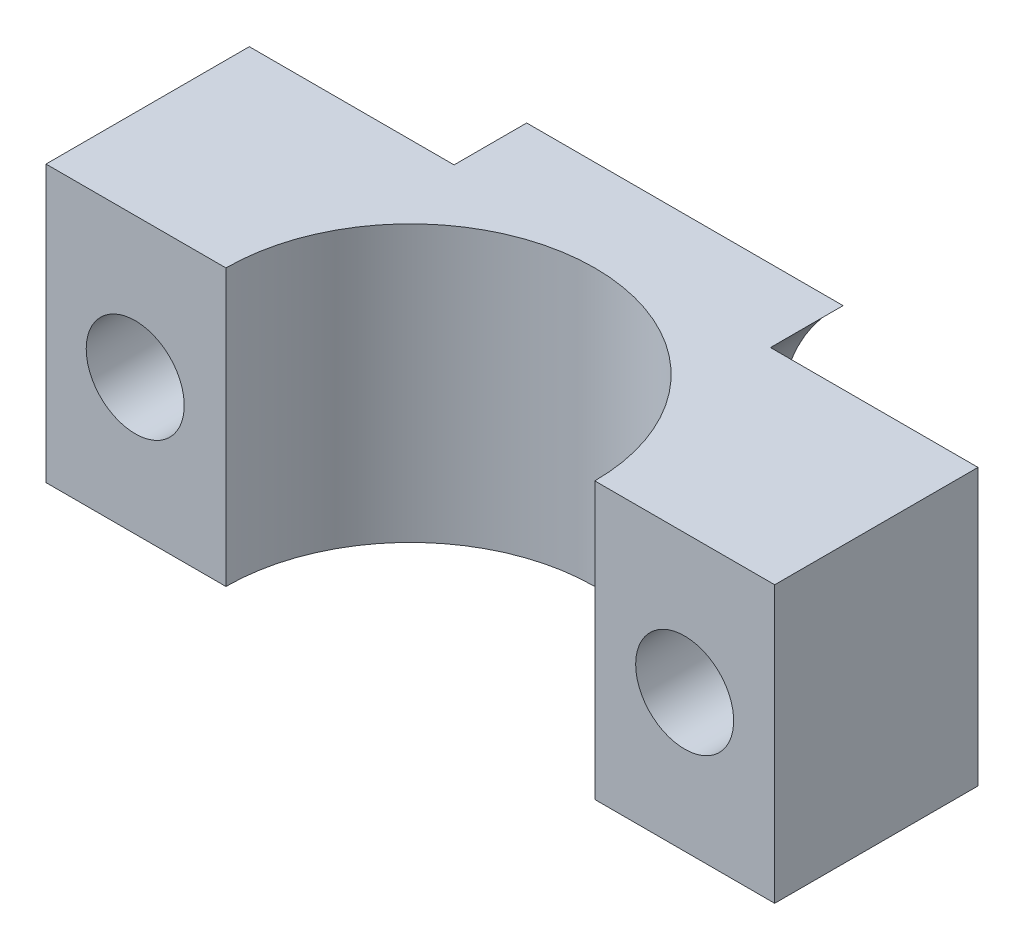
ISO-10303-21;
HEADER;
FILE_DESCRIPTION(('STEP AP214'),'2;1');
FILE_NAME('part.step','',(''),(''),'','','');
FILE_SCHEMA(('AUTOMOTIVE_DESIGN { 1 0 10303 214 1 1 1 1 }'));
ENDSEC;
DATA;
#1=APPLICATION_CONTEXT('core data for automotive mechanical design processes');
#2=APPLICATION_PROTOCOL_DEFINITION('international standard','automotive_design',2000,#1);
#3=PRODUCT_CONTEXT('',#1,'mechanical');
#4=PRODUCT('Part','Part','',(#3));
#5=PRODUCT_RELATED_PRODUCT_CATEGORY('part','',(#4));
#6=PRODUCT_DEFINITION_FORMATION('','',#4);
#7=PRODUCT_DEFINITION_CONTEXT('part definition',#1,'design');
#8=PRODUCT_DEFINITION('design','',#6,#7);
#9=PRODUCT_DEFINITION_SHAPE('','',#8);
#10=(LENGTH_UNIT() NAMED_UNIT(*) SI_UNIT(.MILLI.,.METRE.));
#11=(NAMED_UNIT(*) PLANE_ANGLE_UNIT() SI_UNIT($,.RADIAN.));
#12=(NAMED_UNIT(*) SI_UNIT($,.STERADIAN.) SOLID_ANGLE_UNIT());
#13=UNCERTAINTY_MEASURE_WITH_UNIT(LENGTH_MEASURE(1.E-05),#10,'distance_accuracy_value','');
#14=(GEOMETRIC_REPRESENTATION_CONTEXT(3) GLOBAL_UNCERTAINTY_ASSIGNED_CONTEXT((#13)) GLOBAL_UNIT_ASSIGNED_CONTEXT((#10,
#11,#12)) REPRESENTATION_CONTEXT('',''));
#15=CARTESIAN_POINT('',(0.,0.,0.));
#16=DIRECTION('',(0.,0.,1.));
#17=DIRECTION('',(1.,0.,0.));
#18=AXIS2_PLACEMENT_3D('',#15,#16,#17);
#19=CARTESIAN_POINT('',(0.,9.5,0.));
#20=DIRECTION('',(0.,-1.,0.));
#21=DIRECTION('',(0.,0.,-1.));
#22=AXIS2_PLACEMENT_3D('',#19,#20,#21);
#23=CYLINDRICAL_SURFACE('',#22,12.7);
#24=CARTESIAN_POINT('',(0.,-9.5,0.));
#25=DIRECTION('',(0.,1.,0.));
#26=DIRECTION('',(0.,0.,1.));
#27=AXIS2_PLACEMENT_3D('',#24,#25,#26);
#28=CIRCLE('',#27,12.7);
#29=CARTESIAN_POINT('',(12.7,-9.5,0.));
#30=VERTEX_POINT('',#29);
#31=CARTESIAN_POINT('',(-12.7,-9.5,0.));
#32=VERTEX_POINT('',#31);
#33=EDGE_CURVE('E176',#30,#32,#28,.T.);
#34=ORIENTED_EDGE('',*,*,#33,.F.);
#35=DIRECTION('',(0.,-1.,0.));
#36=VECTOR('',#35,1.);
#37=CARTESIAN_POINT('',(12.7,9.5,0.));
#38=LINE('',#37,#36);
#39=CARTESIAN_POINT('',(12.7,9.5,0.));
#40=VERTEX_POINT('',#39);
#41=EDGE_CURVE('E146',#40,#30,#38,.T.);
#42=ORIENTED_EDGE('',*,*,#41,.F.);
#43=CARTESIAN_POINT('',(0.,9.5,0.));
#44=DIRECTION('',(0.,1.,0.));
#45=DIRECTION('',(0.,0.,1.));
#46=AXIS2_PLACEMENT_3D('',#43,#44,#45);
#47=CIRCLE('',#46,12.7);
#48=CARTESIAN_POINT('',(-12.7,9.5,0.));
#49=VERTEX_POINT('',#48);
#50=EDGE_CURVE('E170',#40,#49,#47,.T.);
#51=ORIENTED_EDGE('',*,*,#50,.T.);
#52=DIRECTION('',(0.,-1.,0.));
#53=VECTOR('',#52,1.);
#54=CARTESIAN_POINT('',(-12.7,9.5,0.));
#55=LINE('',#54,#53);
#56=EDGE_CURVE('E138',#49,#32,#55,.T.);
#57=ORIENTED_EDGE('',*,*,#56,.T.);
#58=EDGE_LOOP('',(#34,#42,#51,#57));
#59=FACE_BOUND('',#58,.T.);
#60=ADVANCED_FACE('F32',(#59),#23,.F.);
#61=CARTESIAN_POINT('',(0.,9.5,0.));
#62=DIRECTION('',(0.,0.,-1.));
#63=DIRECTION('',(-1.,0.,0.));
#64=AXIS2_PLACEMENT_3D('',#61,#62,#63);
#65=PLANE('',#64);
#66=CARTESIAN_POINT('',(18.8898376590317,-0.0280681094487162,0.));
#67=DIRECTION('',(0.,0.,-1.));
#68=DIRECTION('',(-1.,0.,0.));
#69=AXIS2_PLACEMENT_3D('',#66,#67,#68);
#70=CIRCLE('',#69,3.375);
#71=CARTESIAN_POINT('',(15.5148376590317,-0.0280681094487162,0.));
#72=VERTEX_POINT('',#71);
#73=EDGE_CURVE('E114',#72,#72,#70,.T.);
#74=ORIENTED_EDGE('',*,*,#73,.T.);
#75=EDGE_LOOP('',(#74));
#76=FACE_BOUND('',#75,.T.);
#77=DIRECTION('',(1.,0.,0.));
#78=VECTOR('',#77,1.);
#79=CARTESIAN_POINT('',(0.,-9.5,0.));
#80=LINE('',#79,#78);
#81=CARTESIAN_POINT('',(25.09,-9.5,0.));
#82=VERTEX_POINT('',#81);
#83=EDGE_CURVE('E134',#30,#82,#80,.T.);
#84=ORIENTED_EDGE('',*,*,#83,.T.);
#85=DIRECTION('',(0.,-1.,0.));
#86=VECTOR('',#85,1.);
#87=CARTESIAN_POINT('',(25.09,9.5,0.));
#88=LINE('',#87,#86);
#89=CARTESIAN_POINT('',(25.09,9.5,0.));
#90=VERTEX_POINT('',#89);
#91=EDGE_CURVE('E143',#90,#82,#88,.T.);
#92=ORIENTED_EDGE('',*,*,#91,.F.);
#93=DIRECTION('',(1.,0.,0.));
#94=VECTOR('',#93,1.);
#95=CARTESIAN_POINT('',(0.,9.5,0.));
#96=LINE('',#95,#94);
#97=EDGE_CURVE('E164',#40,#90,#96,.T.);
#98=ORIENTED_EDGE('',*,*,#97,.F.);
#99=ORIENTED_EDGE('',*,*,#41,.T.);
#100=EDGE_LOOP('',(#84,#92,#98,#99));
#101=FACE_BOUND('',#100,.T.);
#102=ADVANCED_FACE('F224',(#76,#101),#65,.F.);
#103=CARTESIAN_POINT('',(25.09,9.5,0.));
#104=DIRECTION('',(-1.,0.,0.));
#105=DIRECTION('',(0.,0.,1.));
#106=AXIS2_PLACEMENT_3D('',#103,#104,#105);
#107=PLANE('',#106);
#108=DIRECTION('',(0.,0.,-1.));
#109=VECTOR('',#108,1.);
#110=CARTESIAN_POINT('',(25.09,-9.5,0.));
#111=LINE('',#110,#109);
#112=CARTESIAN_POINT('',(25.09,-9.5,-14.));
#113=VERTEX_POINT('',#112);
#114=EDGE_CURVE('E128',#82,#113,#111,.T.);
#115=ORIENTED_EDGE('',*,*,#114,.T.);
#116=DIRECTION('',(0.,1.,0.));
#117=VECTOR('',#116,1.);
#118=CARTESIAN_POINT('',(25.09,9.5,-14.));
#119=LINE('',#118,#117);
#120=CARTESIAN_POINT('',(25.09,9.5,-14.));
#121=VERTEX_POINT('',#120);
#122=EDGE_CURVE('E113',#113,#121,#119,.T.);
#123=ORIENTED_EDGE('',*,*,#122,.T.);
#124=DIRECTION('',(0.,0.,-1.));
#125=VECTOR('',#124,1.);
#126=CARTESIAN_POINT('',(25.09,9.5,0.));
#127=LINE('',#126,#125);
#128=EDGE_CURVE('E161',#90,#121,#127,.T.);
#129=ORIENTED_EDGE('',*,*,#128,.F.);
#130=ORIENTED_EDGE('',*,*,#91,.T.);
#131=EDGE_LOOP('',(#115,#123,#129,#130));
#132=FACE_BOUND('',#131,.T.);
#133=ADVANCED_FACE('F228',(#132),#107,.F.);
#134=CARTESIAN_POINT('',(0.,9.5,-19.));
#135=DIRECTION('',(0.,0.,-1.));
#136=DIRECTION('',(-1.,0.,0.));
#137=AXIS2_PLACEMENT_3D('',#134,#135,#136);
#138=PLANE('',#137);
#139=CARTESIAN_POINT('',(18.8898376590317,-0.0280681094487162,-19.));
#140=DIRECTION('',(0.,0.,-1.));
#141=DIRECTION('',(-1.,0.,0.));
#142=AXIS2_PLACEMENT_3D('',#139,#140,#141);
#143=CIRCLE('',#142,12.5);
#144=CARTESIAN_POINT('',(10.7330916006603,-9.5,-19.));
#145=VERTEX_POINT('',#144);
#146=CARTESIAN_POINT('',(10.7987364915944,9.5,-19.));
#147=VERTEX_POINT('',#146);
#148=EDGE_CURVE('E46',#145,#147,#143,.T.);
#149=ORIENTED_EDGE('',*,*,#148,.F.);
#150=DIRECTION('',(1.,0.,0.));
#151=VECTOR('',#150,1.);
#152=CARTESIAN_POINT('',(0.,-9.5,-19.));
#153=LINE('',#152,#151);
#154=CARTESIAN_POINT('',(-10.6606389463509,-9.5,-19.));
#155=VERTEX_POINT('',#154);
#156=EDGE_CURVE('E120',#155,#145,#153,.T.);
#157=ORIENTED_EDGE('',*,*,#156,.F.);
#158=CARTESIAN_POINT('',(-18.9459738779293,-0.140340547243853,-19.));
#159=DIRECTION('',(0.,0.,-1.));
#160=DIRECTION('',(-1.,0.,0.));
#161=AXIS2_PLACEMENT_3D('',#158,#159,#160);
#162=CIRCLE('',#161,12.5);
#163=CARTESIAN_POINT('',(-10.9889748121278,9.5,-19.));
#164=VERTEX_POINT('',#163);
#165=EDGE_CURVE('E54',#164,#155,#162,.T.);
#166=ORIENTED_EDGE('',*,*,#165,.F.);
#167=DIRECTION('',(1.,0.,0.));
#168=VECTOR('',#167,1.);
#169=CARTESIAN_POINT('',(0.,9.5,-19.));
#170=LINE('',#169,#168);
#171=EDGE_CURVE('E122',#164,#147,#170,.T.);
#172=ORIENTED_EDGE('',*,*,#171,.T.);
#173=EDGE_LOOP('',(#149,#157,#166,#172));
#174=FACE_BOUND('',#173,.T.);
#175=ADVANCED_FACE('F119',(#174),#138,.T.);
#176=CARTESIAN_POINT('',(-25.09,9.5,0.));
#177=DIRECTION('',(-1.,0.,0.));
#178=DIRECTION('',(0.,0.,1.));
#179=AXIS2_PLACEMENT_3D('',#176,#177,#178);
#180=PLANE('',#179);
#181=DIRECTION('',(0.,1.,0.));
#182=VECTOR('',#181,1.);
#183=CARTESIAN_POINT('',(-25.09,9.5,-14.));
#184=LINE('',#183,#182);
#185=CARTESIAN_POINT('',(-25.09,-9.5,-14.));
#186=VERTEX_POINT('',#185);
#187=CARTESIAN_POINT('',(-25.09,9.5,-14.));
#188=VERTEX_POINT('',#187);
#189=EDGE_CURVE('E189',#186,#188,#184,.T.);
#190=ORIENTED_EDGE('',*,*,#189,.F.);
#191=DIRECTION('',(0.,0.,-1.));
#192=VECTOR('',#191,1.);
#193=CARTESIAN_POINT('',(-25.09,-9.5,0.));
#194=LINE('',#193,#192);
#195=CARTESIAN_POINT('',(-25.09,-9.5,0.));
#196=VERTEX_POINT('',#195);
#197=EDGE_CURVE('E127',#196,#186,#194,.T.);
#198=ORIENTED_EDGE('',*,*,#197,.F.);
#199=DIRECTION('',(0.,-1.,0.));
#200=VECTOR('',#199,1.);
#201=CARTESIAN_POINT('',(-25.09,9.5,0.));
#202=LINE('',#201,#200);
#203=CARTESIAN_POINT('',(-25.09,9.5,0.));
#204=VERTEX_POINT('',#203);
#205=EDGE_CURVE('E140',#204,#196,#202,.T.);
#206=ORIENTED_EDGE('',*,*,#205,.F.);
#207=DIRECTION('',(0.,0.,-1.));
#208=VECTOR('',#207,1.);
#209=CARTESIAN_POINT('',(-25.09,9.5,0.));
#210=LINE('',#209,#208);
#211=EDGE_CURVE('E168',#204,#188,#210,.T.);
#212=ORIENTED_EDGE('',*,*,#211,.T.);
#213=EDGE_LOOP('',(#190,#198,#206,#212));
#214=FACE_BOUND('',#213,.T.);
#215=ADVANCED_FACE('F239',(#214),#180,.T.);
#216=CARTESIAN_POINT('',(-18.9459738779293,-0.140340547243853,0.));
#217=DIRECTION('',(0.,0.,-1.));
#218=DIRECTION('',(-1.,0.,0.));
#219=AXIS2_PLACEMENT_3D('',#216,#217,#218);
#220=CIRCLE('',#219,3.375);
#221=CARTESIAN_POINT('',(-22.3209738779293,-0.140340547243853,0.));
#222=VERTEX_POINT('',#221);
#223=EDGE_CURVE('E193',#222,#222,#220,.T.);
#224=ORIENTED_EDGE('',*,*,#223,.T.);
#225=EDGE_LOOP('',(#224));
#226=FACE_BOUND('',#225,.T.);
#227=EDGE_CURVE('E131',#196,#32,#80,.T.);
#228=ORIENTED_EDGE('',*,*,#227,.T.);
#229=ORIENTED_EDGE('',*,*,#56,.F.);
#230=EDGE_CURVE('E141',#204,#49,#96,.T.);
#231=ORIENTED_EDGE('',*,*,#230,.F.);
#232=ORIENTED_EDGE('',*,*,#205,.T.);
#233=EDGE_LOOP('',(#228,#229,#231,#232));
#234=FACE_BOUND('',#233,.T.);
#235=ADVANCED_FACE('F231',(#226,#234),#65,.F.);
#236=CARTESIAN_POINT('',(0.,9.5,0.));
#237=DIRECTION('',(0.,1.,0.));
#238=DIRECTION('',(0.,0.,1.));
#239=AXIS2_PLACEMENT_3D('',#236,#237,#238);
#240=PLANE('',#239);
#241=DIRECTION('',(1.,0.,0.));
#242=VECTOR('',#241,1.);
#243=CARTESIAN_POINT('',(0.,9.5,-14.));
#244=LINE('',#243,#242);
#245=CARTESIAN_POINT('',(10.7987364915944,9.5,-14.));
#246=VERTEX_POINT('',#245);
#247=EDGE_CURVE('E11',#246,#121,#244,.T.);
#248=ORIENTED_EDGE('',*,*,#247,.F.);
#249=DIRECTION('',(0.,0.,-1.));
#250=VECTOR('',#249,1.);
#251=CARTESIAN_POINT('',(10.7987364915944,9.5,-19.));
#252=LINE('',#251,#250);
#253=EDGE_CURVE('E39',#147,#246,#252,.F.);
#254=ORIENTED_EDGE('',*,*,#253,.F.);
#255=ORIENTED_EDGE('',*,*,#171,.F.);
#256=DIRECTION('',(0.,0.,-1.));
#257=VECTOR('',#256,1.);
#258=CARTESIAN_POINT('',(-10.9889748121278,9.5,-19.));
#259=LINE('',#258,#257);
#260=CARTESIAN_POINT('',(-10.9889748121278,9.5,-14.));
#261=VERTEX_POINT('',#260);
#262=EDGE_CURVE('E191',#261,#164,#259,.T.);
#263=ORIENTED_EDGE('',*,*,#262,.F.);
#264=DIRECTION('',(1.,0.,0.));
#265=VECTOR('',#264,1.);
#266=CARTESIAN_POINT('',(0.,9.5,-14.));
#267=LINE('',#266,#265);
#268=EDGE_CURVE('E178',#188,#261,#267,.T.);
#269=ORIENTED_EDGE('',*,*,#268,.F.);
#270=ORIENTED_EDGE('',*,*,#211,.F.);
#271=ORIENTED_EDGE('',*,*,#230,.T.);
#272=ORIENTED_EDGE('',*,*,#50,.F.);
#273=ORIENTED_EDGE('',*,*,#97,.T.);
#274=ORIENTED_EDGE('',*,*,#128,.T.);
#275=EDGE_LOOP('',(#248,#254,#255,#263,#269,#270,#271,#272,#273,#274));
#276=FACE_BOUND('',#275,.T.);
#277=ADVANCED_FACE('F159',(#276),#240,.T.);
#278=CARTESIAN_POINT('',(0.,-9.5,0.));
#279=DIRECTION('',(0.,1.,0.));
#280=DIRECTION('',(0.,0.,1.));
#281=AXIS2_PLACEMENT_3D('',#278,#279,#280);
#282=PLANE('',#281);
#283=ORIENTED_EDGE('',*,*,#156,.T.);
#284=DIRECTION('',(0.,0.,-1.));
#285=VECTOR('',#284,1.);
#286=CARTESIAN_POINT('',(10.7330916006603,-9.5,-19.));
#287=LINE('',#286,#285);
#288=CARTESIAN_POINT('',(10.7330916006603,-9.5,-14.));
#289=VERTEX_POINT('',#288);
#290=EDGE_CURVE('E106',#145,#289,#287,.F.);
#291=ORIENTED_EDGE('',*,*,#290,.T.);
#292=DIRECTION('',(1.,0.,0.));
#293=VECTOR('',#292,1.);
#294=CARTESIAN_POINT('',(0.,-9.5,-14.));
#295=LINE('',#294,#293);
#296=EDGE_CURVE('E155',#289,#113,#295,.T.);
#297=ORIENTED_EDGE('',*,*,#296,.T.);
#298=ORIENTED_EDGE('',*,*,#114,.F.);
#299=ORIENTED_EDGE('',*,*,#83,.F.);
#300=ORIENTED_EDGE('',*,*,#33,.T.);
#301=ORIENTED_EDGE('',*,*,#227,.F.);
#302=ORIENTED_EDGE('',*,*,#197,.T.);
#303=DIRECTION('',(1.,0.,0.));
#304=VECTOR('',#303,1.);
#305=CARTESIAN_POINT('',(0.,-9.5,-14.));
#306=LINE('',#305,#304);
#307=CARTESIAN_POINT('',(-10.6606389463509,-9.5,-14.));
#308=VERTEX_POINT('',#307);
#309=EDGE_CURVE('E149',#186,#308,#306,.T.);
#310=ORIENTED_EDGE('',*,*,#309,.T.);
#311=DIRECTION('',(0.,0.,-1.));
#312=VECTOR('',#311,1.);
#313=CARTESIAN_POINT('',(-10.6606389463509,-9.5,-19.));
#314=LINE('',#313,#312);
#315=EDGE_CURVE('E126',#308,#155,#314,.T.);
#316=ORIENTED_EDGE('',*,*,#315,.T.);
#317=EDGE_LOOP('',(#283,#291,#297,#298,#299,#300,#301,#302,#310,#316));
#318=FACE_BOUND('',#317,.T.);
#319=ADVANCED_FACE('F124',(#318),#282,.F.);
#320=CARTESIAN_POINT('',(-18.9459738779293,-0.140340547243853,-19.));
#321=DIRECTION('',(0.,0.,-1.));
#322=DIRECTION('',(-1.,0.,0.));
#323=AXIS2_PLACEMENT_3D('',#320,#321,#322);
#324=CYLINDRICAL_SURFACE('',#323,3.375);
#325=ORIENTED_EDGE('',*,*,#223,.F.);
#326=EDGE_LOOP('',(#325));
#327=FACE_BOUND('',#326,.T.);
#328=CARTESIAN_POINT('',(-18.9459738779293,-0.140340547243853,-14.));
#329=DIRECTION('',(0.,0.,-1.));
#330=DIRECTION('',(-1.,0.,0.));
#331=AXIS2_PLACEMENT_3D('',#328,#329,#330);
#332=CIRCLE('',#331,3.37500000000001);
#333=CARTESIAN_POINT('',(-22.3209738779293,-0.140340547243853,-14.));
#334=VERTEX_POINT('',#333);
#335=EDGE_CURVE('E196',#334,#334,#332,.T.);
#336=ORIENTED_EDGE('',*,*,#335,.T.);
#337=EDGE_LOOP('',(#336));
#338=FACE_BOUND('',#337,.T.);
#339=ADVANCED_FACE('F283',(#327,#338),#324,.F.);
#340=CARTESIAN_POINT('',(-15.5709738779293,-0.140340547243853,-14.));
#341=DIRECTION('',(0.,0.,1.));
#342=DIRECTION('',(1.,0.,0.));
#343=AXIS2_PLACEMENT_3D('',#340,#341,#342);
#344=PLANE('',#343);
#345=ORIENTED_EDGE('',*,*,#268,.T.);
#346=CARTESIAN_POINT('',(-18.9459738779293,-0.140340547243853,-14.));
#347=DIRECTION('',(0.,0.,-1.));
#348=DIRECTION('',(-1.,0.,0.));
#349=AXIS2_PLACEMENT_3D('',#346,#347,#348);
#350=CIRCLE('',#349,12.5);
#351=EDGE_CURVE('E199',#261,#308,#350,.T.);
#352=ORIENTED_EDGE('',*,*,#351,.T.);
#353=ORIENTED_EDGE('',*,*,#309,.F.);
#354=ORIENTED_EDGE('',*,*,#189,.T.);
#355=EDGE_LOOP('',(#345,#352,#353,#354));
#356=FACE_BOUND('',#355,.T.);
#357=ORIENTED_EDGE('',*,*,#335,.F.);
#358=EDGE_LOOP('',(#357));
#359=FACE_BOUND('',#358,.T.);
#360=ADVANCED_FACE('F220',(#356,#359),#344,.F.);
#361=CARTESIAN_POINT('',(-18.9459738779293,-0.140340547243853,-19.));
#362=DIRECTION('',(0.,0.,-1.));
#363=DIRECTION('',(-1.,0.,0.));
#364=AXIS2_PLACEMENT_3D('',#361,#362,#363);
#365=CYLINDRICAL_SURFACE('',#364,12.5);
#366=ORIENTED_EDGE('',*,*,#262,.T.);
#367=ORIENTED_EDGE('',*,*,#165,.T.);
#368=ORIENTED_EDGE('',*,*,#315,.F.);
#369=ORIENTED_EDGE('',*,*,#351,.F.);
#370=EDGE_LOOP('',(#366,#367,#368,#369));
#371=FACE_BOUND('',#370,.T.);
#372=ADVANCED_FACE('F213',(#371),#365,.F.);
#373=CARTESIAN_POINT('',(22.2648376590317,-0.0280681094487162,-14.));
#374=DIRECTION('',(0.,0.,1.));
#375=DIRECTION('',(1.,0.,0.));
#376=AXIS2_PLACEMENT_3D('',#373,#374,#375);
#377=PLANE('',#376);
#378=CARTESIAN_POINT('',(18.8898376590317,-0.0280681094487162,-14.));
#379=DIRECTION('',(0.,0.,-1.));
#380=DIRECTION('',(-1.,0.,0.));
#381=AXIS2_PLACEMENT_3D('',#378,#379,#380);
#382=CIRCLE('',#381,3.37500000000001);
#383=CARTESIAN_POINT('',(15.5148376590317,-0.0280681094487162,-14.));
#384=VERTEX_POINT('',#383);
#385=EDGE_CURVE('E156',#384,#384,#382,.T.);
#386=ORIENTED_EDGE('',*,*,#385,.F.);
#387=EDGE_LOOP('',(#386));
#388=FACE_BOUND('',#387,.T.);
#389=CARTESIAN_POINT('',(18.8898376590317,-0.0280681094487162,-14.));
#390=DIRECTION('',(0.,0.,-1.));
#391=DIRECTION('',(-1.,0.,0.));
#392=AXIS2_PLACEMENT_3D('',#389,#390,#391);
#393=CIRCLE('',#392,12.5);
#394=EDGE_CURVE('E109',#289,#246,#393,.T.);
#395=ORIENTED_EDGE('',*,*,#394,.T.);
#396=ORIENTED_EDGE('',*,*,#247,.T.);
#397=ORIENTED_EDGE('',*,*,#122,.F.);
#398=ORIENTED_EDGE('',*,*,#296,.F.);
#399=EDGE_LOOP('',(#395,#396,#397,#398));
#400=FACE_BOUND('',#399,.T.);
#401=ADVANCED_FACE('F153',(#388,#400),#377,.F.);
#402=CARTESIAN_POINT('',(18.8898376590317,-0.0280681094487162,-19.));
#403=DIRECTION('',(0.,0.,-1.));
#404=DIRECTION('',(-1.,0.,0.));
#405=AXIS2_PLACEMENT_3D('',#402,#403,#404);
#406=CYLINDRICAL_SURFACE('',#405,12.5);
#407=ORIENTED_EDGE('',*,*,#148,.T.);
#408=ORIENTED_EDGE('',*,*,#253,.T.);
#409=ORIENTED_EDGE('',*,*,#394,.F.);
#410=ORIENTED_EDGE('',*,*,#290,.F.);
#411=EDGE_LOOP('',(#407,#408,#409,#410));
#412=FACE_BOUND('',#411,.T.);
#413=ADVANCED_FACE('F107',(#412),#406,.F.);
#414=CARTESIAN_POINT('',(18.8898376590317,-0.0280681094487162,-19.));
#415=DIRECTION('',(0.,0.,-1.));
#416=DIRECTION('',(-1.,0.,0.));
#417=AXIS2_PLACEMENT_3D('',#414,#415,#416);
#418=CYLINDRICAL_SURFACE('',#417,3.375);
#419=ORIENTED_EDGE('',*,*,#73,.F.);
#420=EDGE_LOOP('',(#419));
#421=FACE_BOUND('',#420,.T.);
#422=ORIENTED_EDGE('',*,*,#385,.T.);
#423=EDGE_LOOP('',(#422));
#424=FACE_BOUND('',#423,.T.);
#425=ADVANCED_FACE('F210',(#421,#424),#418,.F.);
#426=CLOSED_SHELL('',(#60,#102,#133,#175,#215,#235,#277,#319,#339,#360,#372,#401,#413,#425));
#427=MANIFOLD_SOLID_BREP('B2',#426);
#428=ADVANCED_BREP_SHAPE_REPRESENTATION('',(#18,#427),#14);
#429=SHAPE_DEFINITION_REPRESENTATION(#9,#428);
ENDSEC;
END-ISO-10303-21;
